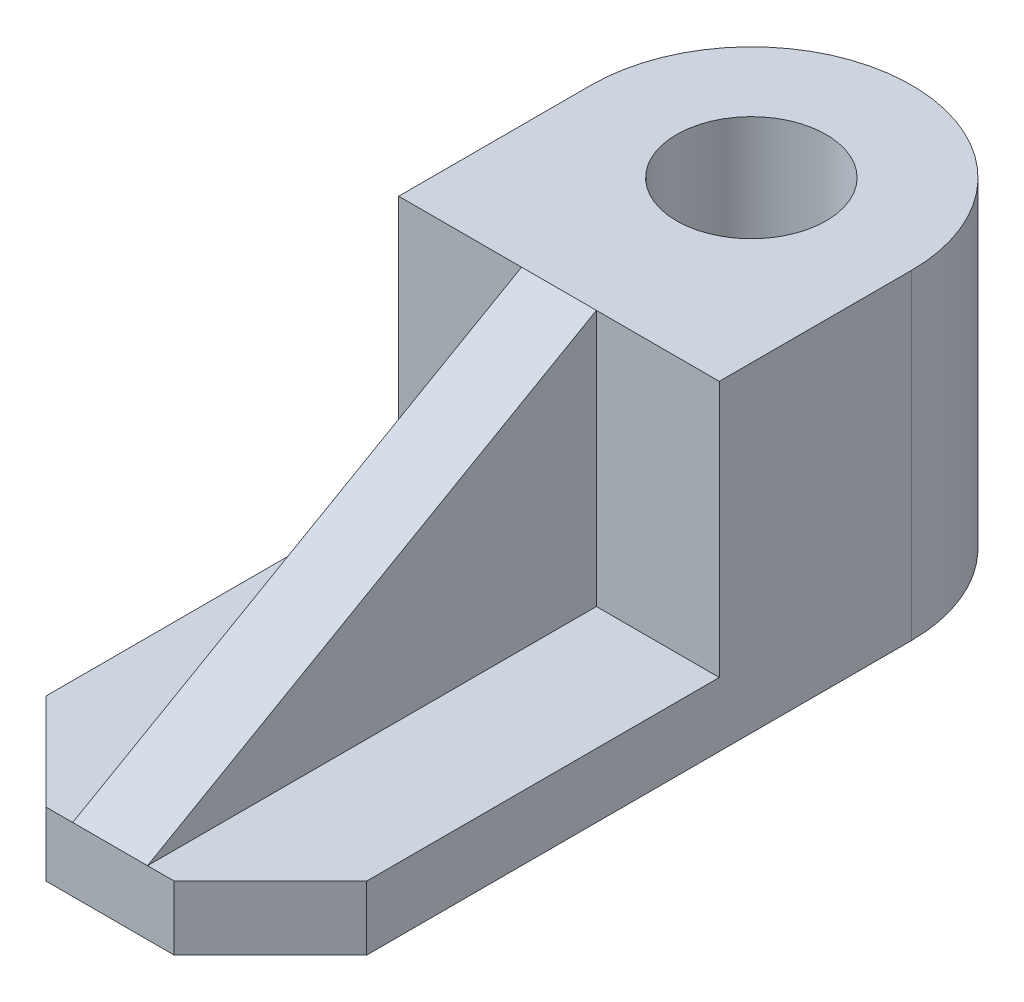
ISO-10303-21;
HEADER;
FILE_DESCRIPTION(('STEP AP214'),'2;1');
FILE_NAME('part.step','',(''),(''),'','','');
FILE_SCHEMA(('AUTOMOTIVE_DESIGN { 1 0 10303 214 1 1 1 1 }'));
ENDSEC;
DATA;
#1=APPLICATION_CONTEXT('core data for automotive mechanical design processes');
#2=APPLICATION_PROTOCOL_DEFINITION('international standard','automotive_design',2000,#1);
#3=PRODUCT_CONTEXT('',#1,'mechanical');
#4=PRODUCT('Part','Part','',(#3));
#5=PRODUCT_RELATED_PRODUCT_CATEGORY('part','',(#4));
#6=PRODUCT_DEFINITION_FORMATION('','',#4);
#7=PRODUCT_DEFINITION_CONTEXT('part definition',#1,'design');
#8=PRODUCT_DEFINITION('design','',#6,#7);
#9=PRODUCT_DEFINITION_SHAPE('','',#8);
#10=(LENGTH_UNIT() NAMED_UNIT(*) SI_UNIT(.MILLI.,.METRE.));
#11=(NAMED_UNIT(*) PLANE_ANGLE_UNIT() SI_UNIT($,.RADIAN.));
#12=(NAMED_UNIT(*) SI_UNIT($,.STERADIAN.) SOLID_ANGLE_UNIT());
#13=UNCERTAINTY_MEASURE_WITH_UNIT(LENGTH_MEASURE(1.E-05),#10,'distance_accuracy_value','');
#14=(GEOMETRIC_REPRESENTATION_CONTEXT(3) GLOBAL_UNCERTAINTY_ASSIGNED_CONTEXT((#13)) GLOBAL_UNIT_ASSIGNED_CONTEXT((#10,
#11,#12)) REPRESENTATION_CONTEXT('',''));
#15=CARTESIAN_POINT('',(0.,0.,0.));
#16=DIRECTION('',(0.,0.,1.));
#17=DIRECTION('',(1.,0.,0.));
#18=AXIS2_PLACEMENT_3D('',#15,#16,#17);
#19=CARTESIAN_POINT('',(0.,30.,0.));
#20=DIRECTION('',(0.,0.,-1.));
#21=DIRECTION('',(-1.,0.,0.));
#22=AXIS2_PLACEMENT_3D('',#19,#20,#21);
#23=PLANE('',#22);
#24=DIRECTION('',(0.,1.,0.));
#25=VECTOR('',#24,1.);
#26=CARTESIAN_POINT('',(18.5,30.,0.));
#27=LINE('',#26,#25);
#28=CARTESIAN_POINT('',(18.5,6.,0.));
#29=VERTEX_POINT('',#28);
#30=CARTESIAN_POINT('',(18.5,30.,0.));
#31=VERTEX_POINT('',#30);
#32=EDGE_CURVE('E114',#29,#31,#27,.T.);
#33=ORIENTED_EDGE('',*,*,#32,.F.);
#34=DIRECTION('',(1.,0.,0.));
#35=VECTOR('',#34,1.);
#36=CARTESIAN_POINT('',(30.,6.,0.));
#37=LINE('',#36,#35);
#38=CARTESIAN_POINT('',(30.,6.,0.));
#39=VERTEX_POINT('',#38);
#40=EDGE_CURVE('E56',#29,#39,#37,.T.);
#41=ORIENTED_EDGE('',*,*,#40,.T.);
#42=DIRECTION('',(0.,-1.,0.));
#43=VECTOR('',#42,1.);
#44=CARTESIAN_POINT('',(30.,30.,0.));
#45=LINE('',#44,#43);
#46=CARTESIAN_POINT('',(30.,30.,0.));
#47=VERTEX_POINT('',#46);
#48=EDGE_CURVE('E132',#47,#39,#45,.T.);
#49=ORIENTED_EDGE('',*,*,#48,.F.);
#50=DIRECTION('',(1.,0.,0.));
#51=VECTOR('',#50,1.);
#52=CARTESIAN_POINT('',(0.,30.,0.));
#53=LINE('',#52,#51);
#54=EDGE_CURVE('E130',#31,#47,#53,.T.);
#55=ORIENTED_EDGE('',*,*,#54,.F.);
#56=EDGE_LOOP('',(#33,#41,#49,#55));
#57=FACE_BOUND('',#56,.T.);
#58=ADVANCED_FACE('F33',(#57),#23,.F.);
#59=CARTESIAN_POINT('',(0.,6.,0.));
#60=DIRECTION('',(0.,1.,0.));
#61=DIRECTION('',(0.,0.,1.));
#62=AXIS2_PLACEMENT_3D('',#59,#60,#61);
#63=PLANE('',#62);
#64=ORIENTED_EDGE('',*,*,#40,.F.);
#65=DIRECTION('',(0.,0.,1.));
#66=VECTOR('',#65,1.);
#67=CARTESIAN_POINT('',(18.5,6.,0.));
#68=LINE('',#67,#66);
#69=CARTESIAN_POINT('',(18.5,6.,42.));
#70=VERTEX_POINT('',#69);
#71=EDGE_CURVE('E41',#29,#70,#68,.T.);
#72=ORIENTED_EDGE('',*,*,#71,.T.);
#73=DIRECTION('',(-1.,0.,0.));
#74=VECTOR('',#73,1.);
#75=CARTESIAN_POINT('',(21.,6.,42.));
#76=LINE('',#75,#74);
#77=CARTESIAN_POINT('',(21.,6.,42.));
#78=VERTEX_POINT('',#77);
#79=EDGE_CURVE('E163',#78,#70,#76,.T.);
#80=ORIENTED_EDGE('',*,*,#79,.F.);
#81=DIRECTION('',(-0.707106781186547,0.,0.707106781186547));
#82=VECTOR('',#81,1.);
#83=CARTESIAN_POINT('',(21.,6.,42.));
#84=LINE('',#83,#82);
#85=CARTESIAN_POINT('',(30.,6.,33.));
#86=VERTEX_POINT('',#85);
#87=EDGE_CURVE('E159',#86,#78,#84,.T.);
#88=ORIENTED_EDGE('',*,*,#87,.F.);
#89=DIRECTION('',(0.,0.,1.));
#90=VECTOR('',#89,1.);
#91=CARTESIAN_POINT('',(30.,6.,33.));
#92=LINE('',#91,#90);
#93=EDGE_CURVE('E156',#39,#86,#92,.T.);
#94=ORIENTED_EDGE('',*,*,#93,.F.);
#95=EDGE_LOOP('',(#64,#72,#80,#88,#94));
#96=FACE_BOUND('',#95,.T.);
#97=ADVANCED_FACE('F211',(#96),#63,.T.);
#98=CARTESIAN_POINT('',(15.,30.,-18.));
#99=DIRECTION('',(0.,1.,0.));
#100=DIRECTION('',(0.,0.,1.));
#101=AXIS2_PLACEMENT_3D('',#98,#99,#100);
#102=PLANE('',#101);
#103=CARTESIAN_POINT('',(15.,30.,-18.));
#104=DIRECTION('',(0.,1.,0.));
#105=DIRECTION('',(0.,0.,1.));
#106=AXIS2_PLACEMENT_3D('',#103,#104,#105);
#107=CIRCLE('',#106,7.);
#108=CARTESIAN_POINT('',(15.,30.,-11.));
#109=VERTEX_POINT('',#108);
#110=EDGE_CURVE('E184',#109,#109,#107,.T.);
#111=ORIENTED_EDGE('',*,*,#110,.F.);
#112=EDGE_LOOP('',(#111));
#113=FACE_BOUND('',#112,.T.);
#114=CARTESIAN_POINT('',(15.,30.,-18.));
#115=DIRECTION('',(0.,1.,0.));
#116=DIRECTION('',(0.,0.,1.));
#117=AXIS2_PLACEMENT_3D('',#114,#115,#116);
#118=CIRCLE('',#117,15.);
#119=CARTESIAN_POINT('',(30.,30.,-18.));
#120=VERTEX_POINT('',#119);
#121=CARTESIAN_POINT('',(0.,30.,-18.));
#122=VERTEX_POINT('',#121);
#123=EDGE_CURVE('E194',#120,#122,#118,.T.);
#124=ORIENTED_EDGE('',*,*,#123,.T.);
#125=DIRECTION('',(0.,0.,1.));
#126=VECTOR('',#125,1.);
#127=CARTESIAN_POINT('',(0.,30.,0.));
#128=LINE('',#127,#126);
#129=CARTESIAN_POINT('',(0.,30.,0.));
#130=VERTEX_POINT('',#129);
#131=EDGE_CURVE('E136',#122,#130,#128,.T.);
#132=ORIENTED_EDGE('',*,*,#131,.T.);
#133=CARTESIAN_POINT('',(11.5,30.,0.));
#134=VERTEX_POINT('',#133);
#135=EDGE_CURVE('E135',#130,#134,#53,.T.);
#136=ORIENTED_EDGE('',*,*,#135,.T.);
#137=DIRECTION('',(-1.,0.,0.));
#138=VECTOR('',#137,1.);
#139=CARTESIAN_POINT('',(0.,30.,0.));
#140=LINE('',#139,#138);
#141=EDGE_CURVE('E125',#134,#31,#140,.F.);
#142=ORIENTED_EDGE('',*,*,#141,.T.);
#143=ORIENTED_EDGE('',*,*,#54,.T.);
#144=DIRECTION('',(0.,0.,-1.));
#145=VECTOR('',#144,1.);
#146=CARTESIAN_POINT('',(30.,30.,0.));
#147=LINE('',#146,#145);
#148=EDGE_CURVE('E192',#47,#120,#147,.T.);
#149=ORIENTED_EDGE('',*,*,#148,.T.);
#150=EDGE_LOOP('',(#124,#132,#136,#142,#143,#149));
#151=FACE_BOUND('',#150,.T.);
#152=ADVANCED_FACE('F139',(#113,#151),#102,.T.);
#153=CARTESIAN_POINT('',(15.,0.,-18.));
#154=DIRECTION('',(0.,1.,0.));
#155=DIRECTION('',(0.,0.,1.));
#156=AXIS2_PLACEMENT_3D('',#153,#154,#155);
#157=PLANE('',#156);
#158=CARTESIAN_POINT('',(15.,0.,-18.));
#159=DIRECTION('',(0.,1.,0.));
#160=DIRECTION('',(0.,0.,1.));
#161=AXIS2_PLACEMENT_3D('',#158,#159,#160);
#162=CIRCLE('',#161,7.);
#163=CARTESIAN_POINT('',(15.,0.,-11.));
#164=VERTEX_POINT('',#163);
#165=EDGE_CURVE('E176',#164,#164,#162,.T.);
#166=ORIENTED_EDGE('',*,*,#165,.T.);
#167=EDGE_LOOP('',(#166));
#168=FACE_BOUND('',#167,.T.);
#169=DIRECTION('',(0.,0.,1.));
#170=VECTOR('',#169,1.);
#171=CARTESIAN_POINT('',(0.,0.,0.));
#172=LINE('',#171,#170);
#173=CARTESIAN_POINT('',(0.,0.,-18.));
#174=VERTEX_POINT('',#173);
#175=CARTESIAN_POINT('',(0.,0.,33.));
#176=VERTEX_POINT('',#175);
#177=EDGE_CURVE('E187',#174,#176,#172,.T.);
#178=ORIENTED_EDGE('',*,*,#177,.F.);
#179=CARTESIAN_POINT('',(15.,0.,-18.));
#180=DIRECTION('',(0.,1.,0.));
#181=DIRECTION('',(0.,0.,1.));
#182=AXIS2_PLACEMENT_3D('',#179,#180,#181);
#183=CIRCLE('',#182,15.);
#184=CARTESIAN_POINT('',(30.,0.,-18.));
#185=VERTEX_POINT('',#184);
#186=EDGE_CURVE('E190',#185,#174,#183,.T.);
#187=ORIENTED_EDGE('',*,*,#186,.F.);
#188=DIRECTION('',(0.,0.,-1.));
#189=VECTOR('',#188,1.);
#190=CARTESIAN_POINT('',(30.,0.,0.));
#191=LINE('',#190,#189);
#192=CARTESIAN_POINT('',(30.,0.,33.));
#193=VERTEX_POINT('',#192);
#194=EDGE_CURVE('E198',#193,#185,#191,.T.);
#195=ORIENTED_EDGE('',*,*,#194,.F.);
#196=DIRECTION('',(-0.707106781186547,0.,0.707106781186547));
#197=VECTOR('',#196,1.);
#198=CARTESIAN_POINT('',(21.,0.,42.));
#199=LINE('',#198,#197);
#200=CARTESIAN_POINT('',(21.,0.,42.));
#201=VERTEX_POINT('',#200);
#202=EDGE_CURVE('E141',#193,#201,#199,.T.);
#203=ORIENTED_EDGE('',*,*,#202,.T.);
#204=DIRECTION('',(-1.,0.,0.));
#205=VECTOR('',#204,1.);
#206=CARTESIAN_POINT('',(21.,0.,42.));
#207=LINE('',#206,#205);
#208=CARTESIAN_POINT('',(9.,0.,42.));
#209=VERTEX_POINT('',#208);
#210=EDGE_CURVE('E144',#201,#209,#207,.T.);
#211=ORIENTED_EDGE('',*,*,#210,.T.);
#212=DIRECTION('',(-0.707106781186547,0.,-0.707106781186548));
#213=VECTOR('',#212,1.);
#214=CARTESIAN_POINT('',(9.,0.,42.));
#215=LINE('',#214,#213);
#216=EDGE_CURVE('E152',#209,#176,#215,.T.);
#217=ORIENTED_EDGE('',*,*,#216,.T.);
#218=EDGE_LOOP('',(#178,#187,#195,#203,#211,#217));
#219=FACE_BOUND('',#218,.T.);
#220=ADVANCED_FACE('F246',(#168,#219),#157,.F.);
#221=CARTESIAN_POINT('',(0.,30.,0.));
#222=DIRECTION('',(1.,0.,0.));
#223=DIRECTION('',(0.,0.,-1.));
#224=AXIS2_PLACEMENT_3D('',#221,#222,#223);
#225=PLANE('',#224);
#226=ORIENTED_EDGE('',*,*,#177,.T.);
#227=DIRECTION('',(0.,-1.,0.));
#228=VECTOR('',#227,1.);
#229=CARTESIAN_POINT('',(0.,6.,33.));
#230=LINE('',#229,#228);
#231=CARTESIAN_POINT('',(0.,6.,33.));
#232=VERTEX_POINT('',#231);
#233=EDGE_CURVE('E173',#232,#176,#230,.T.);
#234=ORIENTED_EDGE('',*,*,#233,.F.);
#235=DIRECTION('',(0.,0.,-1.));
#236=VECTOR('',#235,1.);
#237=CARTESIAN_POINT('',(0.,6.,33.));
#238=LINE('',#237,#236);
#239=CARTESIAN_POINT('',(0.,6.,0.));
#240=VERTEX_POINT('',#239);
#241=EDGE_CURVE('E149',#232,#240,#238,.T.);
#242=ORIENTED_EDGE('',*,*,#241,.T.);
#243=DIRECTION('',(0.,-1.,0.));
#244=VECTOR('',#243,1.);
#245=CARTESIAN_POINT('',(0.,30.,0.));
#246=LINE('',#245,#244);
#247=EDGE_CURVE('E207',#130,#240,#246,.T.);
#248=ORIENTED_EDGE('',*,*,#247,.F.);
#249=ORIENTED_EDGE('',*,*,#131,.F.);
#250=DIRECTION('',(0.,-1.,0.));
#251=VECTOR('',#250,1.);
#252=CARTESIAN_POINT('',(0.,30.,-18.));
#253=LINE('',#252,#251);
#254=EDGE_CURVE('E196',#122,#174,#253,.T.);
#255=ORIENTED_EDGE('',*,*,#254,.T.);
#256=EDGE_LOOP('',(#226,#234,#242,#248,#249,#255));
#257=FACE_BOUND('',#256,.T.);
#258=ADVANCED_FACE('F35',(#257),#225,.F.);
#259=CARTESIAN_POINT('',(11.5,6.,0.));
#260=VERTEX_POINT('',#259);
#261=EDGE_CURVE('E153',#240,#260,#37,.T.);
#262=ORIENTED_EDGE('',*,*,#261,.T.);
#263=DIRECTION('',(0.,1.,0.));
#264=VECTOR('',#263,1.);
#265=CARTESIAN_POINT('',(11.5,30.,0.));
#266=LINE('',#265,#264);
#267=EDGE_CURVE('E118',#260,#134,#266,.T.);
#268=ORIENTED_EDGE('',*,*,#267,.T.);
#269=ORIENTED_EDGE('',*,*,#135,.F.);
#270=ORIENTED_EDGE('',*,*,#247,.T.);
#271=EDGE_LOOP('',(#262,#268,#269,#270));
#272=FACE_BOUND('',#271,.T.);
#273=ADVANCED_FACE('F233',(#272),#23,.F.);
#274=CARTESIAN_POINT('',(30.,30.,0.));
#275=DIRECTION('',(-1.,0.,0.));
#276=DIRECTION('',(0.,0.,1.));
#277=AXIS2_PLACEMENT_3D('',#274,#275,#276);
#278=PLANE('',#277);
#279=ORIENTED_EDGE('',*,*,#194,.T.);
#280=DIRECTION('',(0.,-1.,0.));
#281=VECTOR('',#280,1.);
#282=CARTESIAN_POINT('',(30.,30.,-18.));
#283=LINE('',#282,#281);
#284=EDGE_CURVE('E203',#120,#185,#283,.T.);
#285=ORIENTED_EDGE('',*,*,#284,.F.);
#286=ORIENTED_EDGE('',*,*,#148,.F.);
#287=ORIENTED_EDGE('',*,*,#48,.T.);
#288=ORIENTED_EDGE('',*,*,#93,.T.);
#289=DIRECTION('',(0.,-1.,0.));
#290=VECTOR('',#289,1.);
#291=CARTESIAN_POINT('',(30.,6.,33.));
#292=LINE('',#291,#290);
#293=EDGE_CURVE('E168',#86,#193,#292,.T.);
#294=ORIENTED_EDGE('',*,*,#293,.T.);
#295=EDGE_LOOP('',(#279,#285,#286,#287,#288,#294));
#296=FACE_BOUND('',#295,.T.);
#297=ADVANCED_FACE('F220',(#296),#278,.F.);
#298=CARTESIAN_POINT('',(15.,30.,-18.));
#299=DIRECTION('',(0.,-1.,0.));
#300=DIRECTION('',(0.,0.,-1.));
#301=AXIS2_PLACEMENT_3D('',#298,#299,#300);
#302=CYLINDRICAL_SURFACE('',#301,15.);
#303=ORIENTED_EDGE('',*,*,#254,.F.);
#304=ORIENTED_EDGE('',*,*,#123,.F.);
#305=ORIENTED_EDGE('',*,*,#284,.T.);
#306=ORIENTED_EDGE('',*,*,#186,.T.);
#307=EDGE_LOOP('',(#303,#304,#305,#306));
#308=FACE_BOUND('',#307,.T.);
#309=ADVANCED_FACE('F227',(#308),#302,.T.);
#310=CARTESIAN_POINT('',(15.,30.,-18.));
#311=DIRECTION('',(0.,-1.,0.));
#312=DIRECTION('',(0.,0.,-1.));
#313=AXIS2_PLACEMENT_3D('',#310,#311,#312);
#314=CYLINDRICAL_SURFACE('',#313,7.);
#315=ORIENTED_EDGE('',*,*,#165,.F.);
#316=EDGE_LOOP('',(#315));
#317=FACE_BOUND('',#316,.T.);
#318=ORIENTED_EDGE('',*,*,#110,.T.);
#319=EDGE_LOOP('',(#318));
#320=FACE_BOUND('',#319,.T.);
#321=ADVANCED_FACE('F270',(#317,#320),#314,.F.);
#322=CARTESIAN_POINT('',(9.,6.,42.));
#323=DIRECTION('',(-0.707106781186548,0.,0.707106781186547));
#324=DIRECTION('',(0.707106781186547,0.,0.707106781186548));
#325=AXIS2_PLACEMENT_3D('',#322,#323,#324);
#326=PLANE('',#325);
#327=ORIENTED_EDGE('',*,*,#216,.F.);
#328=DIRECTION('',(0.,-1.,0.));
#329=VECTOR('',#328,1.);
#330=CARTESIAN_POINT('',(9.,6.,42.));
#331=LINE('',#330,#329);
#332=CARTESIAN_POINT('',(9.,6.,42.));
#333=VERTEX_POINT('',#332);
#334=EDGE_CURVE('E177',#333,#209,#331,.T.);
#335=ORIENTED_EDGE('',*,*,#334,.F.);
#336=DIRECTION('',(-0.707106781186547,0.,-0.707106781186548));
#337=VECTOR('',#336,1.);
#338=CARTESIAN_POINT('',(9.,6.,42.));
#339=LINE('',#338,#337);
#340=EDGE_CURVE('E166',#333,#232,#339,.T.);
#341=ORIENTED_EDGE('',*,*,#340,.T.);
#342=ORIENTED_EDGE('',*,*,#233,.T.);
#343=EDGE_LOOP('',(#327,#335,#341,#342));
#344=FACE_BOUND('',#343,.T.);
#345=ADVANCED_FACE('F244',(#344),#326,.T.);
#346=CARTESIAN_POINT('',(21.,6.,42.));
#347=DIRECTION('',(0.,0.,1.));
#348=DIRECTION('',(1.,0.,0.));
#349=AXIS2_PLACEMENT_3D('',#346,#347,#348);
#350=PLANE('',#349);
#351=ORIENTED_EDGE('',*,*,#334,.T.);
#352=ORIENTED_EDGE('',*,*,#210,.F.);
#353=DIRECTION('',(0.,-1.,0.));
#354=VECTOR('',#353,1.);
#355=CARTESIAN_POINT('',(21.,6.,42.));
#356=LINE('',#355,#354);
#357=EDGE_CURVE('E180',#78,#201,#356,.T.);
#358=ORIENTED_EDGE('',*,*,#357,.F.);
#359=ORIENTED_EDGE('',*,*,#79,.T.);
#360=CARTESIAN_POINT('',(11.5,6.,42.));
#361=VERTEX_POINT('',#360);
#362=EDGE_CURVE('E128',#70,#361,#76,.T.);
#363=ORIENTED_EDGE('',*,*,#362,.T.);
#364=EDGE_CURVE('E162',#361,#333,#76,.T.);
#365=ORIENTED_EDGE('',*,*,#364,.T.);
#366=EDGE_LOOP('',(#351,#352,#358,#359,#363,#365));
#367=FACE_BOUND('',#366,.T.);
#368=ADVANCED_FACE('F214',(#367),#350,.T.);
#369=CARTESIAN_POINT('',(21.,6.,42.));
#370=DIRECTION('',(0.707106781186548,0.,0.707106781186548));
#371=DIRECTION('',(0.707106781186548,0.,-0.707106781186548));
#372=AXIS2_PLACEMENT_3D('',#369,#370,#371);
#373=PLANE('',#372);
#374=ORIENTED_EDGE('',*,*,#202,.F.);
#375=ORIENTED_EDGE('',*,*,#293,.F.);
#376=ORIENTED_EDGE('',*,*,#87,.T.);
#377=ORIENTED_EDGE('',*,*,#357,.T.);
#378=EDGE_LOOP('',(#374,#375,#376,#377));
#379=FACE_BOUND('',#378,.T.);
#380=ADVANCED_FACE('F218',(#379),#373,.T.);
#381=DIRECTION('',(0.,0.,1.));
#382=VECTOR('',#381,1.);
#383=CARTESIAN_POINT('',(11.5,6.,0.));
#384=LINE('',#383,#382);
#385=EDGE_CURVE('E11',#260,#361,#384,.T.);
#386=ORIENTED_EDGE('',*,*,#385,.F.);
#387=ORIENTED_EDGE('',*,*,#261,.F.);
#388=ORIENTED_EDGE('',*,*,#241,.F.);
#389=ORIENTED_EDGE('',*,*,#340,.F.);
#390=ORIENTED_EDGE('',*,*,#364,.F.);
#391=EDGE_LOOP('',(#386,#387,#388,#389,#390));
#392=FACE_BOUND('',#391,.T.);
#393=ADVANCED_FACE('F239',(#392),#63,.T.);
#394=CARTESIAN_POINT('',(15.,30.,0.));
#395=DIRECTION('',(0.,-0.868243142124459,-0.496138938356834));
#396=DIRECTION('',(0.,-0.496138938356834,0.868243142124459));
#397=AXIS2_PLACEMENT_3D('',#394,#395,#396);
#398=PLANE('',#397);
#399=ORIENTED_EDGE('',*,*,#141,.F.);
#400=DIRECTION('',(0.,-0.496138938356834,0.868243142124459));
#401=VECTOR('',#400,1.);
#402=CARTESIAN_POINT('',(11.5,30.,0.));
#403=LINE('',#402,#401);
#404=EDGE_CURVE('E119',#134,#361,#403,.T.);
#405=ORIENTED_EDGE('',*,*,#404,.T.);
#406=ORIENTED_EDGE('',*,*,#362,.F.);
#407=DIRECTION('',(0.,-0.496138938356834,0.868243142124459));
#408=VECTOR('',#407,1.);
#409=CARTESIAN_POINT('',(18.5,30.,0.));
#410=LINE('',#409,#408);
#411=EDGE_CURVE('E48',#31,#70,#410,.T.);
#412=ORIENTED_EDGE('',*,*,#411,.F.);
#413=EDGE_LOOP('',(#399,#405,#406,#412));
#414=FACE_BOUND('',#413,.T.);
#415=ADVANCED_FACE('F122',(#414),#398,.F.);
#416=CARTESIAN_POINT('',(11.5,15.,4.5));
#417=DIRECTION('',(-1.,0.,0.));
#418=DIRECTION('',(0.,0.,1.));
#419=AXIS2_PLACEMENT_3D('',#416,#417,#418);
#420=PLANE('',#419);
#421=ORIENTED_EDGE('',*,*,#267,.F.);
#422=ORIENTED_EDGE('',*,*,#385,.T.);
#423=ORIENTED_EDGE('',*,*,#404,.F.);
#424=EDGE_LOOP('',(#421,#422,#423));
#425=FACE_BOUND('',#424,.T.);
#426=ADVANCED_FACE('F236',(#425),#420,.T.);
#427=CARTESIAN_POINT('',(18.5,15.,4.5));
#428=DIRECTION('',(-1.,0.,0.));
#429=DIRECTION('',(0.,0.,1.));
#430=AXIS2_PLACEMENT_3D('',#427,#428,#429);
#431=PLANE('',#430);
#432=ORIENTED_EDGE('',*,*,#71,.F.);
#433=ORIENTED_EDGE('',*,*,#32,.T.);
#434=ORIENTED_EDGE('',*,*,#411,.T.);
#435=EDGE_LOOP('',(#432,#433,#434));
#436=FACE_BOUND('',#435,.T.);
#437=ADVANCED_FACE('F115',(#436),#431,.F.);
#438=CLOSED_SHELL('',(#58,#97,#152,#220,#258,#273,#297,#309,#321,#345,#368,#380,#393,#415,#426,#437));
#439=MANIFOLD_SOLID_BREP('B2',#438);
#440=ADVANCED_BREP_SHAPE_REPRESENTATION('',(#18,#439),#14);
#441=SHAPE_DEFINITION_REPRESENTATION(#9,#440);
ENDSEC;
END-ISO-10303-21;
